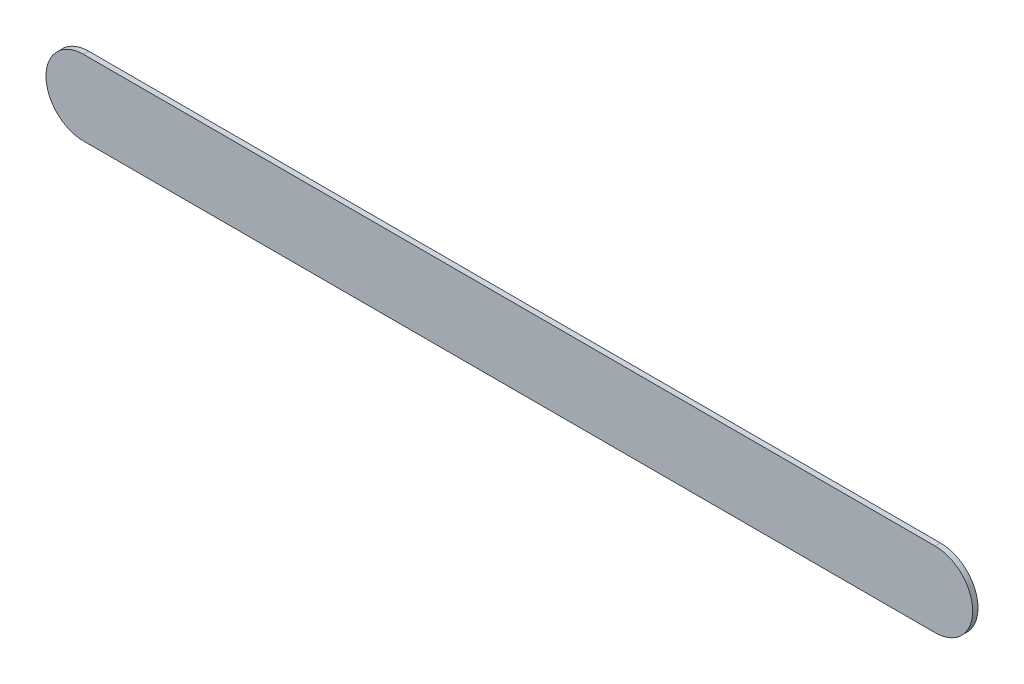
ISO-10303-21;
HEADER;
FILE_DESCRIPTION(('STEP AP214'),'2;1');
FILE_NAME('part.step','',(''),(''),'','','');
FILE_SCHEMA(('AUTOMOTIVE_DESIGN { 1 0 10303 214 1 1 1 1 }'));
ENDSEC;
DATA;
#1=APPLICATION_CONTEXT('core data for automotive mechanical design processes');
#2=APPLICATION_PROTOCOL_DEFINITION('international standard','automotive_design',2000,#1);
#3=PRODUCT_CONTEXT('',#1,'mechanical');
#4=PRODUCT('Part','Part','',(#3));
#5=PRODUCT_RELATED_PRODUCT_CATEGORY('part','',(#4));
#6=PRODUCT_DEFINITION_FORMATION('','',#4);
#7=PRODUCT_DEFINITION_CONTEXT('part definition',#1,'design');
#8=PRODUCT_DEFINITION('design','',#6,#7);
#9=PRODUCT_DEFINITION_SHAPE('','',#8);
#10=(LENGTH_UNIT() NAMED_UNIT(*) SI_UNIT(.MILLI.,.METRE.));
#11=(NAMED_UNIT(*) PLANE_ANGLE_UNIT() SI_UNIT($,.RADIAN.));
#12=(NAMED_UNIT(*) SI_UNIT($,.STERADIAN.) SOLID_ANGLE_UNIT());
#13=UNCERTAINTY_MEASURE_WITH_UNIT(LENGTH_MEASURE(1.E-05),#10,'distance_accuracy_value','');
#14=(GEOMETRIC_REPRESENTATION_CONTEXT(3) GLOBAL_UNCERTAINTY_ASSIGNED_CONTEXT((#13)) GLOBAL_UNIT_ASSIGNED_CONTEXT((#10,
#11,#12)) REPRESENTATION_CONTEXT('',''));
#15=CARTESIAN_POINT('',(0.,0.,0.));
#16=DIRECTION('',(0.,0.,1.));
#17=DIRECTION('',(1.,0.,0.));
#18=AXIS2_PLACEMENT_3D('',#15,#16,#17);
#19=CARTESIAN_POINT('',(86.90600094,102.82401076,0.));
#20=DIRECTION('',(0.,1.,0.));
#21=DIRECTION('',(1.,0.,0.));
#22=AXIS2_PLACEMENT_3D('',#19,#20,#21);
#23=PLANE('',#22);
#24=DIRECTION('',(1.,0.,0.));
#25=VECTOR('',#24,1.);
#26=CARTESIAN_POINT('',(86.90600094,102.82401076,0.03556));
#27=LINE('',#26,#25);
#28=CARTESIAN_POINT('',(86.90600094,102.82401076,0.03556));
#29=VERTEX_POINT('',#28);
#30=CARTESIAN_POINT('',(92.57700306,102.82401076,0.03556));
#31=VERTEX_POINT('',#30);
#32=EDGE_CURVE('E11',#29,#31,#27,.T.);
#33=ORIENTED_EDGE('',*,*,#32,.F.);
#34=DIRECTION('',(0.,0.,1.));
#35=VECTOR('',#34,1.);
#36=CARTESIAN_POINT('',(86.90600094,102.82401076,0.));
#37=LINE('',#36,#35);
#38=CARTESIAN_POINT('',(86.90600094,102.82401076,0.));
#39=VERTEX_POINT('',#38);
#40=EDGE_CURVE('E24',#39,#29,#37,.T.);
#41=ORIENTED_EDGE('',*,*,#40,.F.);
#42=DIRECTION('',(1.,0.,0.));
#43=VECTOR('',#42,1.);
#44=CARTESIAN_POINT('',(86.90600094,102.82401076,0.));
#45=LINE('',#44,#43);
#46=CARTESIAN_POINT('',(92.57700306,102.82401076,0.));
#47=VERTEX_POINT('',#46);
#48=EDGE_CURVE('E75',#39,#47,#45,.T.);
#49=ORIENTED_EDGE('',*,*,#48,.T.);
#50=DIRECTION('',(0.,0.,1.));
#51=VECTOR('',#50,1.);
#52=CARTESIAN_POINT('',(92.57700306,102.82401076,0.));
#53=LINE('',#52,#51);
#54=EDGE_CURVE('E37',#47,#31,#53,.T.);
#55=ORIENTED_EDGE('',*,*,#54,.T.);
#56=EDGE_LOOP('',(#33,#41,#49,#55));
#57=FACE_BOUND('',#56,.T.);
#58=ADVANCED_FACE('F17',(#57),#23,.F.);
#59=CARTESIAN_POINT('',(92.57700306,103.07401026,0.));
#60=DIRECTION('',(0.,0.,-1.));
#61=DIRECTION('',(0.,-1.,0.));
#62=AXIS2_PLACEMENT_3D('',#59,#60,#61);
#63=CYLINDRICAL_SURFACE('',#62,0.249999500000001);
#64=CARTESIAN_POINT('',(92.57700306,103.07401026,0.03556));
#65=DIRECTION('',(0.,0.,1.));
#66=DIRECTION('',(0.,-1.,0.));
#67=AXIS2_PLACEMENT_3D('',#64,#65,#66);
#68=CIRCLE('',#67,0.249999500000001);
#69=CARTESIAN_POINT('',(92.57700306,103.32400976,0.03556));
#70=VERTEX_POINT('',#69);
#71=EDGE_CURVE('E83',#31,#70,#68,.T.);
#72=ORIENTED_EDGE('',*,*,#71,.F.);
#73=ORIENTED_EDGE('',*,*,#54,.F.);
#74=CARTESIAN_POINT('',(92.57700306,103.07401026,0.));
#75=DIRECTION('',(0.,0.,1.));
#76=DIRECTION('',(0.,-1.,0.));
#77=AXIS2_PLACEMENT_3D('',#74,#75,#76);
#78=CIRCLE('',#77,0.249999500000001);
#79=CARTESIAN_POINT('',(92.57700306,103.32400976,0.));
#80=VERTEX_POINT('',#79);
#81=EDGE_CURVE('E81',#47,#80,#78,.T.);
#82=ORIENTED_EDGE('',*,*,#81,.T.);
#83=DIRECTION('',(0.,0.,1.));
#84=VECTOR('',#83,1.);
#85=CARTESIAN_POINT('',(92.57700306,103.32400976,0.));
#86=LINE('',#85,#84);
#87=EDGE_CURVE('E67',#80,#70,#86,.T.);
#88=ORIENTED_EDGE('',*,*,#87,.T.);
#89=EDGE_LOOP('',(#72,#73,#82,#88));
#90=FACE_BOUND('',#89,.T.);
#91=ADVANCED_FACE('F89',(#90),#63,.T.);
#92=CARTESIAN_POINT('',(92.57700306,103.32400976,0.));
#93=DIRECTION('',(0.,-1.,0.));
#94=DIRECTION('',(-1.,0.,0.));
#95=AXIS2_PLACEMENT_3D('',#92,#93,#94);
#96=PLANE('',#95);
#97=DIRECTION('',(-1.,0.,0.));
#98=VECTOR('',#97,1.);
#99=CARTESIAN_POINT('',(92.57700306,103.32400976,0.03556));
#100=LINE('',#99,#98);
#101=CARTESIAN_POINT('',(86.90600094,103.32400976,0.03556));
#102=VERTEX_POINT('',#101);
#103=EDGE_CURVE('E71',#70,#102,#100,.T.);
#104=ORIENTED_EDGE('',*,*,#103,.F.);
#105=ORIENTED_EDGE('',*,*,#87,.F.);
#106=DIRECTION('',(-1.,0.,0.));
#107=VECTOR('',#106,1.);
#108=CARTESIAN_POINT('',(92.57700306,103.32400976,0.));
#109=LINE('',#108,#107);
#110=CARTESIAN_POINT('',(86.90600094,103.32400976,0.));
#111=VERTEX_POINT('',#110);
#112=EDGE_CURVE('E63',#80,#111,#109,.T.);
#113=ORIENTED_EDGE('',*,*,#112,.T.);
#114=DIRECTION('',(0.,0.,1.));
#115=VECTOR('',#114,1.);
#116=CARTESIAN_POINT('',(86.90600094,103.32400976,0.));
#117=LINE('',#116,#115);
#118=EDGE_CURVE('E53',#111,#102,#117,.T.);
#119=ORIENTED_EDGE('',*,*,#118,.T.);
#120=EDGE_LOOP('',(#104,#105,#113,#119));
#121=FACE_BOUND('',#120,.T.);
#122=ADVANCED_FACE('F66',(#121),#96,.F.);
#123=CARTESIAN_POINT('',(86.90600094,103.07401026,0.));
#124=DIRECTION('',(0.,0.,-1.));
#125=DIRECTION('',(0.,1.,0.));
#126=AXIS2_PLACEMENT_3D('',#123,#124,#125);
#127=CYLINDRICAL_SURFACE('',#126,0.249999500000001);
#128=CARTESIAN_POINT('',(86.90600094,103.07401026,0.03556));
#129=DIRECTION('',(0.,0.,1.));
#130=DIRECTION('',(0.,1.,0.));
#131=AXIS2_PLACEMENT_3D('',#128,#129,#130);
#132=CIRCLE('',#131,0.249999500000001);
#133=EDGE_CURVE('E59',#102,#29,#132,.T.);
#134=ORIENTED_EDGE('',*,*,#133,.F.);
#135=ORIENTED_EDGE('',*,*,#118,.F.);
#136=CARTESIAN_POINT('',(86.90600094,103.07401026,0.));
#137=DIRECTION('',(0.,0.,1.));
#138=DIRECTION('',(0.,1.,0.));
#139=AXIS2_PLACEMENT_3D('',#136,#137,#138);
#140=CIRCLE('',#139,0.249999500000001);
#141=EDGE_CURVE('E57',#111,#39,#140,.T.);
#142=ORIENTED_EDGE('',*,*,#141,.T.);
#143=ORIENTED_EDGE('',*,*,#40,.T.);
#144=EDGE_LOOP('',(#134,#135,#142,#143));
#145=FACE_BOUND('',#144,.T.);
#146=ADVANCED_FACE('F55',(#145),#127,.T.);
#147=CARTESIAN_POINT('',(86.90600094,102.82401076,0.));
#148=DIRECTION('',(0.,0.,-1.));
#149=DIRECTION('',(-1.,0.,0.));
#150=AXIS2_PLACEMENT_3D('',#147,#148,#149);
#151=PLANE('',#150);
#152=ORIENTED_EDGE('',*,*,#141,.F.);
#153=ORIENTED_EDGE('',*,*,#112,.F.);
#154=ORIENTED_EDGE('',*,*,#81,.F.);
#155=ORIENTED_EDGE('',*,*,#48,.F.);
#156=EDGE_LOOP('',(#152,#153,#154,#155));
#157=FACE_BOUND('',#156,.T.);
#158=ADVANCED_FACE('F74',(#157),#151,.T.);
#159=CARTESIAN_POINT('',(86.90600094,102.82401076,0.03556));
#160=DIRECTION('',(0.,0.,-1.));
#161=DIRECTION('',(-1.,0.,0.));
#162=AXIS2_PLACEMENT_3D('',#159,#160,#161);
#163=PLANE('',#162);
#164=ORIENTED_EDGE('',*,*,#32,.T.);
#165=ORIENTED_EDGE('',*,*,#71,.T.);
#166=ORIENTED_EDGE('',*,*,#103,.T.);
#167=ORIENTED_EDGE('',*,*,#133,.T.);
#168=EDGE_LOOP('',(#164,#165,#166,#167));
#169=FACE_BOUND('',#168,.T.);
#170=ADVANCED_FACE('F91',(#169),#163,.F.);
#171=CLOSED_SHELL('',(#58,#91,#122,#146,#158,#170));
#172=MANIFOLD_SOLID_BREP('B1',#171);
#173=ADVANCED_BREP_SHAPE_REPRESENTATION('',(#18,#172),#14);
#174=SHAPE_DEFINITION_REPRESENTATION(#9,#173);
ENDSEC;
END-ISO-10303-21;
